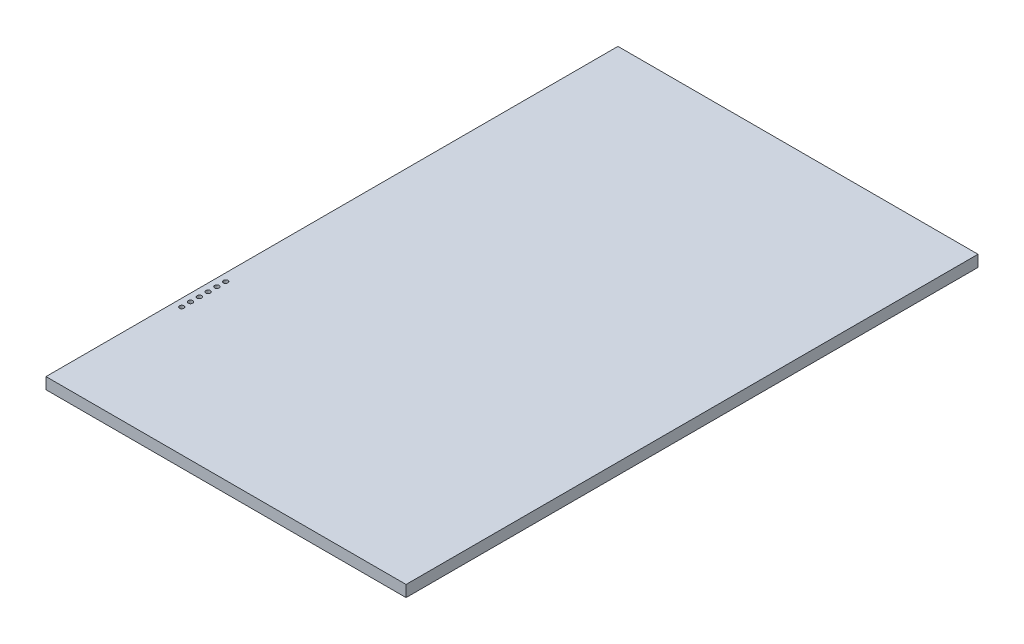
ISO-10303-21;
HEADER;
FILE_DESCRIPTION(('STEP AP214'),'2;1');
FILE_NAME('part.step','',(''),(''),'','','');
FILE_SCHEMA(('AUTOMOTIVE_DESIGN { 1 0 10303 214 1 1 1 1 }'));
ENDSEC;
DATA;
#1=APPLICATION_CONTEXT('core data for automotive mechanical design processes');
#2=APPLICATION_PROTOCOL_DEFINITION('international standard','automotive_design',2000,#1);
#3=PRODUCT_CONTEXT('',#1,'mechanical');
#4=PRODUCT('Part','Part','',(#3));
#5=PRODUCT_RELATED_PRODUCT_CATEGORY('part','',(#4));
#6=PRODUCT_DEFINITION_FORMATION('','',#4);
#7=PRODUCT_DEFINITION_CONTEXT('part definition',#1,'design');
#8=PRODUCT_DEFINITION('design','',#6,#7);
#9=PRODUCT_DEFINITION_SHAPE('','',#8);
#10=(LENGTH_UNIT() NAMED_UNIT(*) SI_UNIT(.MILLI.,.METRE.));
#11=(NAMED_UNIT(*) PLANE_ANGLE_UNIT() SI_UNIT($,.RADIAN.));
#12=(NAMED_UNIT(*) SI_UNIT($,.STERADIAN.) SOLID_ANGLE_UNIT());
#13=UNCERTAINTY_MEASURE_WITH_UNIT(LENGTH_MEASURE(1.E-05),#10,'distance_accuracy_value','');
#14=(GEOMETRIC_REPRESENTATION_CONTEXT(3) GLOBAL_UNCERTAINTY_ASSIGNED_CONTEXT((#13)) GLOBAL_UNIT_ASSIGNED_CONTEXT((#10,
#11,#12)) REPRESENTATION_CONTEXT('',''));
#15=CARTESIAN_POINT('',(0.,0.,0.));
#16=DIRECTION('',(0.,0.,1.));
#17=DIRECTION('',(1.,0.,0.));
#18=AXIS2_PLACEMENT_3D('',#15,#16,#17);
#19=CARTESIAN_POINT('',(1.1,1.65,-24.85));
#20=DIRECTION('',(0.,-1.,0.));
#21=DIRECTION('',(0.,0.,-1.));
#22=AXIS2_PLACEMENT_3D('',#19,#20,#21);
#23=CYLINDRICAL_SURFACE('',#22,0.324999999999998);
#24=CARTESIAN_POINT('',(1.1,1.65,-24.85));
#25=DIRECTION('',(0.,1.,0.));
#26=DIRECTION('',(0.,0.,1.));
#27=AXIS2_PLACEMENT_3D('',#24,#25,#26);
#28=CIRCLE('',#27,0.324999999999998);
#29=CARTESIAN_POINT('',(1.1,1.65,-24.525));
#30=VERTEX_POINT('',#29);
#31=EDGE_CURVE('E50',#30,#30,#28,.T.);
#32=ORIENTED_EDGE('',*,*,#31,.T.);
#33=EDGE_LOOP('',(#32));
#34=FACE_BOUND('',#33,.T.);
#35=CARTESIAN_POINT('',(1.1,0.,-24.85));
#36=DIRECTION('',(0.,1.,0.));
#37=DIRECTION('',(0.,0.,1.));
#38=AXIS2_PLACEMENT_3D('',#35,#36,#37);
#39=CIRCLE('',#38,0.324999999999998);
#40=CARTESIAN_POINT('',(1.1,0.,-24.525));
#41=VERTEX_POINT('',#40);
#42=EDGE_CURVE('E11',#41,#41,#39,.T.);
#43=ORIENTED_EDGE('',*,*,#42,.F.);
#44=EDGE_LOOP('',(#43));
#45=FACE_BOUND('',#44,.T.);
#46=ADVANCED_FACE('F41',(#34,#45),#23,.F.);
#47=CARTESIAN_POINT('',(1.1,1.65,-23.58));
#48=DIRECTION('',(0.,-1.,0.));
#49=DIRECTION('',(0.,0.,-1.));
#50=AXIS2_PLACEMENT_3D('',#47,#48,#49);
#51=CYLINDRICAL_SURFACE('',#50,0.324999999999998);
#52=CARTESIAN_POINT('',(1.1,1.65,-23.58));
#53=DIRECTION('',(0.,1.,0.));
#54=DIRECTION('',(0.,0.,1.));
#55=AXIS2_PLACEMENT_3D('',#52,#53,#54);
#56=CIRCLE('',#55,0.324999999999998);
#57=CARTESIAN_POINT('',(1.1,1.65,-23.255));
#58=VERTEX_POINT('',#57);
#59=EDGE_CURVE('E147',#58,#58,#56,.T.);
#60=ORIENTED_EDGE('',*,*,#59,.T.);
#61=EDGE_LOOP('',(#60));
#62=FACE_BOUND('',#61,.T.);
#63=CARTESIAN_POINT('',(1.1,0.,-23.58));
#64=DIRECTION('',(0.,1.,0.));
#65=DIRECTION('',(0.,0.,1.));
#66=AXIS2_PLACEMENT_3D('',#63,#64,#65);
#67=CIRCLE('',#66,0.324999999999998);
#68=CARTESIAN_POINT('',(1.1,0.,-23.255));
#69=VERTEX_POINT('',#68);
#70=EDGE_CURVE('E151',#69,#69,#67,.T.);
#71=ORIENTED_EDGE('',*,*,#70,.F.);
#72=EDGE_LOOP('',(#71));
#73=FACE_BOUND('',#72,.T.);
#74=ADVANCED_FACE('F177',(#62,#73),#51,.F.);
#75=CARTESIAN_POINT('',(1.1,1.65,-22.31));
#76=DIRECTION('',(0.,-1.,0.));
#77=DIRECTION('',(0.,0.,-1.));
#78=AXIS2_PLACEMENT_3D('',#75,#76,#77);
#79=CYLINDRICAL_SURFACE('',#78,0.324999999999998);
#80=CARTESIAN_POINT('',(1.1,1.65,-22.31));
#81=DIRECTION('',(0.,1.,0.));
#82=DIRECTION('',(0.,0.,1.));
#83=AXIS2_PLACEMENT_3D('',#80,#81,#82);
#84=CIRCLE('',#83,0.324999999999998);
#85=CARTESIAN_POINT('',(1.1,1.65,-21.985));
#86=VERTEX_POINT('',#85);
#87=EDGE_CURVE('E139',#86,#86,#84,.T.);
#88=ORIENTED_EDGE('',*,*,#87,.T.);
#89=EDGE_LOOP('',(#88));
#90=FACE_BOUND('',#89,.T.);
#91=CARTESIAN_POINT('',(1.1,0.,-22.31));
#92=DIRECTION('',(0.,1.,0.));
#93=DIRECTION('',(0.,0.,1.));
#94=AXIS2_PLACEMENT_3D('',#91,#92,#93);
#95=CIRCLE('',#94,0.324999999999998);
#96=CARTESIAN_POINT('',(1.1,0.,-21.985));
#97=VERTEX_POINT('',#96);
#98=EDGE_CURVE('E143',#97,#97,#95,.T.);
#99=ORIENTED_EDGE('',*,*,#98,.F.);
#100=EDGE_LOOP('',(#99));
#101=FACE_BOUND('',#100,.T.);
#102=ADVANCED_FACE('F181',(#90,#101),#79,.F.);
#103=CARTESIAN_POINT('',(1.1,1.65,-21.04));
#104=DIRECTION('',(0.,-1.,0.));
#105=DIRECTION('',(0.,0.,-1.));
#106=AXIS2_PLACEMENT_3D('',#103,#104,#105);
#107=CYLINDRICAL_SURFACE('',#106,0.324999999999998);
#108=CARTESIAN_POINT('',(1.1,1.65,-21.04));
#109=DIRECTION('',(0.,1.,0.));
#110=DIRECTION('',(0.,0.,1.));
#111=AXIS2_PLACEMENT_3D('',#108,#109,#110);
#112=CIRCLE('',#111,0.324999999999998);
#113=CARTESIAN_POINT('',(1.1,1.65,-20.715));
#114=VERTEX_POINT('',#113);
#115=EDGE_CURVE('E131',#114,#114,#112,.T.);
#116=ORIENTED_EDGE('',*,*,#115,.T.);
#117=EDGE_LOOP('',(#116));
#118=FACE_BOUND('',#117,.T.);
#119=CARTESIAN_POINT('',(1.1,0.,-21.04));
#120=DIRECTION('',(0.,1.,0.));
#121=DIRECTION('',(0.,0.,1.));
#122=AXIS2_PLACEMENT_3D('',#119,#120,#121);
#123=CIRCLE('',#122,0.324999999999998);
#124=CARTESIAN_POINT('',(1.1,0.,-20.715));
#125=VERTEX_POINT('',#124);
#126=EDGE_CURVE('E135',#125,#125,#123,.T.);
#127=ORIENTED_EDGE('',*,*,#126,.F.);
#128=EDGE_LOOP('',(#127));
#129=FACE_BOUND('',#128,.T.);
#130=ADVANCED_FACE('F186',(#118,#129),#107,.F.);
#131=CARTESIAN_POINT('',(0.,1.65,0.));
#132=DIRECTION('',(1.,0.,0.));
#133=DIRECTION('',(0.,0.,-1.));
#134=AXIS2_PLACEMENT_3D('',#131,#132,#133);
#135=PLANE('',#134);
#136=DIRECTION('',(0.,0.,1.));
#137=VECTOR('',#136,1.);
#138=CARTESIAN_POINT('',(0.,0.,0.));
#139=LINE('',#138,#137);
#140=CARTESIAN_POINT('',(0.,0.,-82.6));
#141=VERTEX_POINT('',#140);
#142=CARTESIAN_POINT('',(0.,0.,0.));
#143=VERTEX_POINT('',#142);
#144=EDGE_CURVE('E114',#141,#143,#139,.T.);
#145=ORIENTED_EDGE('',*,*,#144,.T.);
#146=DIRECTION('',(0.,-1.,0.));
#147=VECTOR('',#146,1.);
#148=CARTESIAN_POINT('',(0.,1.65,0.));
#149=LINE('',#148,#147);
#150=CARTESIAN_POINT('',(0.,1.65,0.));
#151=VERTEX_POINT('',#150);
#152=EDGE_CURVE('E103',#151,#143,#149,.T.);
#153=ORIENTED_EDGE('',*,*,#152,.F.);
#154=DIRECTION('',(0.,0.,1.));
#155=VECTOR('',#154,1.);
#156=CARTESIAN_POINT('',(0.,1.65,0.));
#157=LINE('',#156,#155);
#158=CARTESIAN_POINT('',(0.,1.65,-82.6));
#159=VERTEX_POINT('',#158);
#160=EDGE_CURVE('E95',#159,#151,#157,.T.);
#161=ORIENTED_EDGE('',*,*,#160,.F.);
#162=DIRECTION('',(0.,-1.,0.));
#163=VECTOR('',#162,1.);
#164=CARTESIAN_POINT('',(0.,1.65,-82.6));
#165=LINE('',#164,#163);
#166=EDGE_CURVE('E110',#159,#141,#165,.T.);
#167=ORIENTED_EDGE('',*,*,#166,.T.);
#168=EDGE_LOOP('',(#145,#153,#161,#167));
#169=FACE_BOUND('',#168,.T.);
#170=ADVANCED_FACE('F193',(#169),#135,.F.);
#171=CARTESIAN_POINT('',(0.,1.65,0.));
#172=DIRECTION('',(0.,0.,-1.));
#173=DIRECTION('',(-1.,0.,0.));
#174=AXIS2_PLACEMENT_3D('',#171,#172,#173);
#175=PLANE('',#174);
#176=DIRECTION('',(1.,0.,0.));
#177=VECTOR('',#176,1.);
#178=CARTESIAN_POINT('',(0.,0.,0.));
#179=LINE('',#178,#177);
#180=CARTESIAN_POINT('',(52.,0.,0.));
#181=VERTEX_POINT('',#180);
#182=EDGE_CURVE('E101',#143,#181,#179,.T.);
#183=ORIENTED_EDGE('',*,*,#182,.T.);
#184=DIRECTION('',(0.,-1.,0.));
#185=VECTOR('',#184,1.);
#186=CARTESIAN_POINT('',(52.,1.65,0.));
#187=LINE('',#186,#185);
#188=CARTESIAN_POINT('',(52.,1.65,0.));
#189=VERTEX_POINT('',#188);
#190=EDGE_CURVE('E99',#189,#181,#187,.T.);
#191=ORIENTED_EDGE('',*,*,#190,.F.);
#192=DIRECTION('',(1.,0.,0.));
#193=VECTOR('',#192,1.);
#194=CARTESIAN_POINT('',(0.,1.65,0.));
#195=LINE('',#194,#193);
#196=EDGE_CURVE('E89',#151,#189,#195,.T.);
#197=ORIENTED_EDGE('',*,*,#196,.F.);
#198=ORIENTED_EDGE('',*,*,#152,.T.);
#199=EDGE_LOOP('',(#183,#191,#197,#198));
#200=FACE_BOUND('',#199,.T.);
#201=ADVANCED_FACE('F100',(#200),#175,.F.);
#202=CARTESIAN_POINT('',(52.,1.65,0.));
#203=DIRECTION('',(-1.,0.,0.));
#204=DIRECTION('',(0.,0.,1.));
#205=AXIS2_PLACEMENT_3D('',#202,#203,#204);
#206=PLANE('',#205);
#207=DIRECTION('',(0.,0.,-1.));
#208=VECTOR('',#207,1.);
#209=CARTESIAN_POINT('',(52.,0.,0.));
#210=LINE('',#209,#208);
#211=CARTESIAN_POINT('',(52.,0.,-82.6));
#212=VERTEX_POINT('',#211);
#213=EDGE_CURVE('E75',#181,#212,#210,.T.);
#214=ORIENTED_EDGE('',*,*,#213,.T.);
#215=DIRECTION('',(0.,-1.,0.));
#216=VECTOR('',#215,1.);
#217=CARTESIAN_POINT('',(52.,1.65,-82.6));
#218=LINE('',#217,#216);
#219=CARTESIAN_POINT('',(52.,1.65,-82.6));
#220=VERTEX_POINT('',#219);
#221=EDGE_CURVE('E104',#220,#212,#218,.T.);
#222=ORIENTED_EDGE('',*,*,#221,.F.);
#223=DIRECTION('',(0.,0.,-1.));
#224=VECTOR('',#223,1.);
#225=CARTESIAN_POINT('',(52.,1.65,0.));
#226=LINE('',#225,#224);
#227=EDGE_CURVE('E93',#189,#220,#226,.T.);
#228=ORIENTED_EDGE('',*,*,#227,.F.);
#229=ORIENTED_EDGE('',*,*,#190,.T.);
#230=EDGE_LOOP('',(#214,#222,#228,#229));
#231=FACE_BOUND('',#230,.T.);
#232=ADVANCED_FACE('F106',(#231),#206,.F.);
#233=CARTESIAN_POINT('',(0.,1.65,-82.6));
#234=DIRECTION('',(0.,0.,1.));
#235=DIRECTION('',(1.,0.,0.));
#236=AXIS2_PLACEMENT_3D('',#233,#234,#235);
#237=PLANE('',#236);
#238=DIRECTION('',(-1.,0.,0.));
#239=VECTOR('',#238,1.);
#240=CARTESIAN_POINT('',(0.,0.,-82.6));
#241=LINE('',#240,#239);
#242=EDGE_CURVE('E81',#212,#141,#241,.T.);
#243=ORIENTED_EDGE('',*,*,#242,.T.);
#244=ORIENTED_EDGE('',*,*,#166,.F.);
#245=DIRECTION('',(-1.,0.,0.));
#246=VECTOR('',#245,1.);
#247=CARTESIAN_POINT('',(0.,1.65,-82.6));
#248=LINE('',#247,#246);
#249=EDGE_CURVE('E58',#220,#159,#248,.T.);
#250=ORIENTED_EDGE('',*,*,#249,.F.);
#251=ORIENTED_EDGE('',*,*,#221,.T.);
#252=EDGE_LOOP('',(#243,#244,#250,#251));
#253=FACE_BOUND('',#252,.T.);
#254=ADVANCED_FACE('F162',(#253),#237,.F.);
#255=CARTESIAN_POINT('',(0.,1.65,0.));
#256=DIRECTION('',(0.,-1.,0.));
#257=DIRECTION('',(0.,0.,-1.));
#258=AXIS2_PLACEMENT_3D('',#255,#256,#257);
#259=PLANE('',#258);
#260=CARTESIAN_POINT('',(1.1,1.65,-19.77));
#261=DIRECTION('',(0.,1.,0.));
#262=DIRECTION('',(0.,0.,1.));
#263=AXIS2_PLACEMENT_3D('',#260,#261,#262);
#264=CIRCLE('',#263,0.324999999999998);
#265=CARTESIAN_POINT('',(1.1,1.65,-19.445));
#266=VERTEX_POINT('',#265);
#267=EDGE_CURVE('E263',#266,#266,#264,.T.);
#268=ORIENTED_EDGE('',*,*,#267,.F.);
#269=EDGE_LOOP('',(#268));
#270=FACE_BOUND('',#269,.T.);
#271=CARTESIAN_POINT('',(1.1,1.65,-18.5));
#272=DIRECTION('',(0.,1.,0.));
#273=DIRECTION('',(0.,0.,1.));
#274=AXIS2_PLACEMENT_3D('',#271,#272,#273);
#275=CIRCLE('',#274,0.324999999999998);
#276=CARTESIAN_POINT('',(1.1,1.65,-18.175));
#277=VERTEX_POINT('',#276);
#278=EDGE_CURVE('E118',#277,#277,#275,.T.);
#279=ORIENTED_EDGE('',*,*,#278,.F.);
#280=EDGE_LOOP('',(#279));
#281=FACE_BOUND('',#280,.T.);
#282=ORIENTED_EDGE('',*,*,#160,.T.);
#283=ORIENTED_EDGE('',*,*,#196,.T.);
#284=ORIENTED_EDGE('',*,*,#227,.T.);
#285=ORIENTED_EDGE('',*,*,#249,.T.);
#286=EDGE_LOOP('',(#282,#283,#284,#285));
#287=FACE_BOUND('',#286,.T.);
#288=ORIENTED_EDGE('',*,*,#115,.F.);
#289=EDGE_LOOP('',(#288));
#290=FACE_BOUND('',#289,.T.);
#291=ORIENTED_EDGE('',*,*,#87,.F.);
#292=EDGE_LOOP('',(#291));
#293=FACE_BOUND('',#292,.T.);
#294=ORIENTED_EDGE('',*,*,#59,.F.);
#295=EDGE_LOOP('',(#294));
#296=FACE_BOUND('',#295,.T.);
#297=ORIENTED_EDGE('',*,*,#31,.F.);
#298=EDGE_LOOP('',(#297));
#299=FACE_BOUND('',#298,.T.);
#300=ADVANCED_FACE('F90',(#270,#281,#287,#290,#293,#296,#299),#259,.F.);
#301=CARTESIAN_POINT('',(0.,0.,0.));
#302=DIRECTION('',(0.,-1.,0.));
#303=DIRECTION('',(0.,0.,-1.));
#304=AXIS2_PLACEMENT_3D('',#301,#302,#303);
#305=PLANE('',#304);
#306=CARTESIAN_POINT('',(1.1,0.,-19.77));
#307=DIRECTION('',(0.,1.,0.));
#308=DIRECTION('',(0.,0.,1.));
#309=AXIS2_PLACEMENT_3D('',#306,#307,#308);
#310=CIRCLE('',#309,0.324999999999998);
#311=CARTESIAN_POINT('',(1.1,0.,-19.445));
#312=VERTEX_POINT('',#311);
#313=EDGE_CURVE('E266',#312,#312,#310,.T.);
#314=ORIENTED_EDGE('',*,*,#313,.T.);
#315=EDGE_LOOP('',(#314));
#316=FACE_BOUND('',#315,.T.);
#317=CARTESIAN_POINT('',(1.1,0.,-18.5));
#318=DIRECTION('',(0.,1.,0.));
#319=DIRECTION('',(0.,0.,1.));
#320=AXIS2_PLACEMENT_3D('',#317,#318,#319);
#321=CIRCLE('',#320,0.324999999999998);
#322=CARTESIAN_POINT('',(1.1,0.,-18.175));
#323=VERTEX_POINT('',#322);
#324=EDGE_CURVE('E268',#323,#323,#321,.T.);
#325=ORIENTED_EDGE('',*,*,#324,.T.);
#326=EDGE_LOOP('',(#325));
#327=FACE_BOUND('',#326,.T.);
#328=ORIENTED_EDGE('',*,*,#144,.F.);
#329=ORIENTED_EDGE('',*,*,#242,.F.);
#330=ORIENTED_EDGE('',*,*,#213,.F.);
#331=ORIENTED_EDGE('',*,*,#182,.F.);
#332=EDGE_LOOP('',(#328,#329,#330,#331));
#333=FACE_BOUND('',#332,.T.);
#334=ORIENTED_EDGE('',*,*,#126,.T.);
#335=EDGE_LOOP('',(#334));
#336=FACE_BOUND('',#335,.T.);
#337=ORIENTED_EDGE('',*,*,#98,.T.);
#338=EDGE_LOOP('',(#337));
#339=FACE_BOUND('',#338,.T.);
#340=ORIENTED_EDGE('',*,*,#70,.T.);
#341=EDGE_LOOP('',(#340));
#342=FACE_BOUND('',#341,.T.);
#343=ORIENTED_EDGE('',*,*,#42,.T.);
#344=EDGE_LOOP('',(#343));
#345=FACE_BOUND('',#344,.T.);
#346=ADVANCED_FACE('F161',(#316,#327,#333,#336,#339,#342,#345),#305,.T.);
#347=CARTESIAN_POINT('',(1.1,1.65,-18.5));
#348=DIRECTION('',(0.,-1.,0.));
#349=DIRECTION('',(0.,0.,-1.));
#350=AXIS2_PLACEMENT_3D('',#347,#348,#349);
#351=CYLINDRICAL_SURFACE('',#350,0.324999999999998);
#352=ORIENTED_EDGE('',*,*,#278,.T.);
#353=EDGE_LOOP('',(#352));
#354=FACE_BOUND('',#353,.T.);
#355=ORIENTED_EDGE('',*,*,#324,.F.);
#356=EDGE_LOOP('',(#355));
#357=FACE_BOUND('',#356,.T.);
#358=ADVANCED_FACE('F169',(#354,#357),#351,.F.);
#359=CARTESIAN_POINT('',(1.1,1.65,-19.77));
#360=DIRECTION('',(0.,-1.,0.));
#361=DIRECTION('',(0.,0.,-1.));
#362=AXIS2_PLACEMENT_3D('',#359,#360,#361);
#363=CYLINDRICAL_SURFACE('',#362,0.324999999999998);
#364=ORIENTED_EDGE('',*,*,#267,.T.);
#365=EDGE_LOOP('',(#364));
#366=FACE_BOUND('',#365,.T.);
#367=ORIENTED_EDGE('',*,*,#313,.F.);
#368=EDGE_LOOP('',(#367));
#369=FACE_BOUND('',#368,.T.);
#370=ADVANCED_FACE('F218',(#366,#369),#363,.F.);
#371=CLOSED_SHELL('',(#46,#74,#102,#130,#170,#201,#232,#254,#300,#346,#358,#370));
#372=MANIFOLD_SOLID_BREP('B2',#371);
#373=ADVANCED_BREP_SHAPE_REPRESENTATION('',(#18,#372),#14);
#374=SHAPE_DEFINITION_REPRESENTATION(#9,#373);
ENDSEC;
END-ISO-10303-21;
